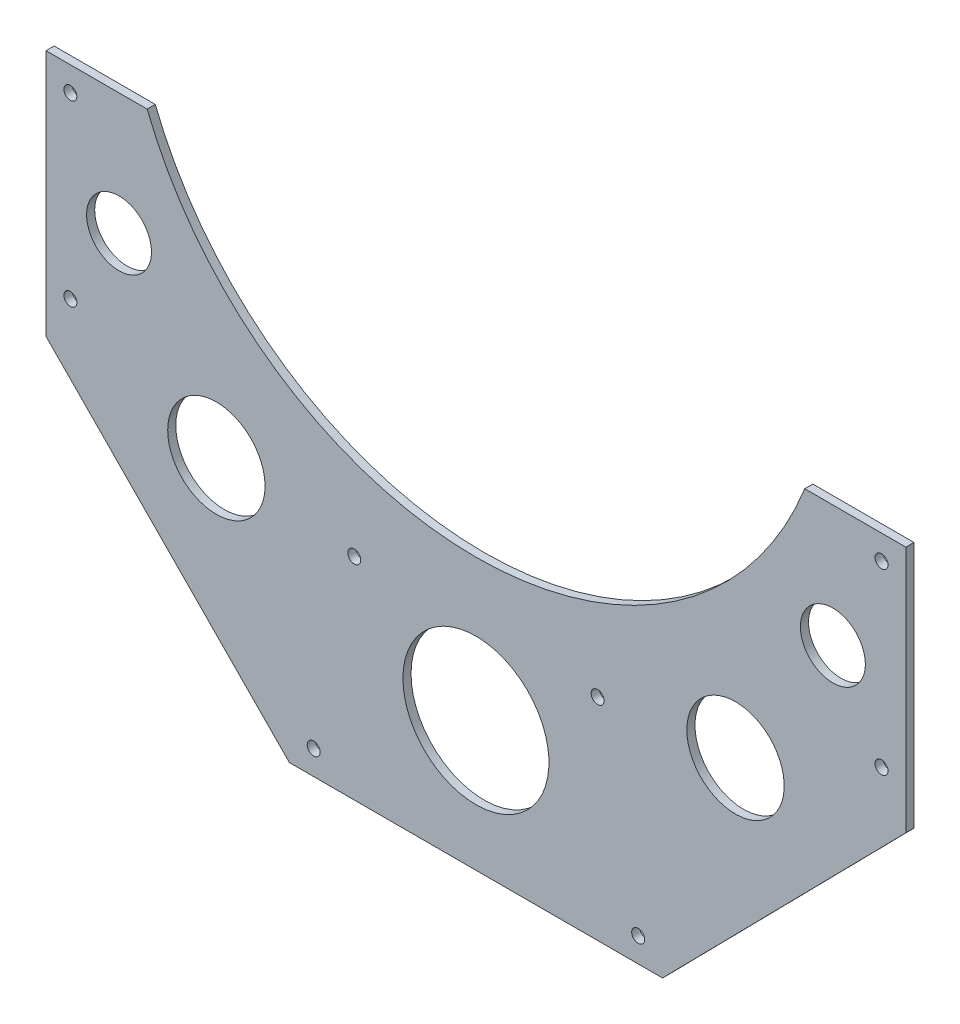
ISO-10303-21;
HEADER;
FILE_DESCRIPTION(('STEP AP214'),'2;1');
FILE_NAME('part.step','',(''),(''),'','','');
FILE_SCHEMA(('AUTOMOTIVE_DESIGN { 1 0 10303 214 1 1 1 1 }'));
ENDSEC;
DATA;
#1=APPLICATION_CONTEXT('core data for automotive mechanical design processes');
#2=APPLICATION_PROTOCOL_DEFINITION('international standard','automotive_design',2000,#1);
#3=PRODUCT_CONTEXT('',#1,'mechanical');
#4=PRODUCT('Part','Part','',(#3));
#5=PRODUCT_RELATED_PRODUCT_CATEGORY('part','',(#4));
#6=PRODUCT_DEFINITION_FORMATION('','',#4);
#7=PRODUCT_DEFINITION_CONTEXT('part definition',#1,'design');
#8=PRODUCT_DEFINITION('design','',#6,#7);
#9=PRODUCT_DEFINITION_SHAPE('','',#8);
#10=(LENGTH_UNIT() NAMED_UNIT(*) SI_UNIT(.MILLI.,.METRE.));
#11=(NAMED_UNIT(*) PLANE_ANGLE_UNIT() SI_UNIT($,.RADIAN.));
#12=(NAMED_UNIT(*) SI_UNIT($,.STERADIAN.) SOLID_ANGLE_UNIT());
#13=UNCERTAINTY_MEASURE_WITH_UNIT(LENGTH_MEASURE(1.E-05),#10,'distance_accuracy_value','');
#14=(GEOMETRIC_REPRESENTATION_CONTEXT(3) GLOBAL_UNCERTAINTY_ASSIGNED_CONTEXT((#13)) GLOBAL_UNIT_ASSIGNED_CONTEXT((#10,
#11,#12)) REPRESENTATION_CONTEXT('',''));
#15=CARTESIAN_POINT('',(0.,0.,0.));
#16=DIRECTION('',(0.,0.,1.));
#17=DIRECTION('',(1.,0.,0.));
#18=AXIS2_PLACEMENT_3D('',#15,#16,#17);
#19=CARTESIAN_POINT('',(0.,610.,10.));
#20=DIRECTION('',(0.,-1.,0.));
#21=DIRECTION('',(0.,0.,-1.));
#22=AXIS2_PLACEMENT_3D('',#19,#20,#21);
#23=PLANE('',#22);
#24=DIRECTION('',(-1.,0.,0.));
#25=VECTOR('',#24,1.);
#26=CARTESIAN_POINT('',(0.,610.,0.));
#27=LINE('',#26,#25);
#28=CARTESIAN_POINT('',(1060.,610.,0.));
#29=VERTEX_POINT('',#28);
#30=CARTESIAN_POINT('',(935.312302428634,610.,0.));
#31=VERTEX_POINT('',#30);
#32=EDGE_CURVE('E119',#29,#31,#27,.T.);
#33=ORIENTED_EDGE('',*,*,#32,.T.);
#34=DIRECTION('',(0.,0.,1.));
#35=VECTOR('',#34,1.);
#36=CARTESIAN_POINT('',(935.312302428634,610.,0.));
#37=LINE('',#36,#35);
#38=CARTESIAN_POINT('',(935.312302428634,610.,10.));
#39=VERTEX_POINT('',#38);
#40=EDGE_CURVE('E59',#31,#39,#37,.T.);
#41=ORIENTED_EDGE('',*,*,#40,.T.);
#42=DIRECTION('',(-1.,0.,0.));
#43=VECTOR('',#42,1.);
#44=CARTESIAN_POINT('',(0.,610.,10.));
#45=LINE('',#44,#43);
#46=CARTESIAN_POINT('',(1060.,610.,10.));
#47=VERTEX_POINT('',#46);
#48=EDGE_CURVE('E130',#47,#39,#45,.T.);
#49=ORIENTED_EDGE('',*,*,#48,.F.);
#50=DIRECTION('',(0.,0.,-1.));
#51=VECTOR('',#50,1.);
#52=CARTESIAN_POINT('',(1060.,610.,10.));
#53=LINE('',#52,#51);
#54=EDGE_CURVE('E11',#47,#29,#53,.T.);
#55=ORIENTED_EDGE('',*,*,#54,.T.);
#56=EDGE_LOOP('',(#33,#41,#49,#55));
#57=FACE_BOUND('',#56,.T.);
#58=ADVANCED_FACE('F35',(#57),#23,.F.);
#59=CARTESIAN_POINT('',(0.,0.,10.));
#60=DIRECTION('',(1.,0.,0.));
#61=DIRECTION('',(0.,0.,-1.));
#62=AXIS2_PLACEMENT_3D('',#59,#60,#61);
#63=PLANE('',#62);
#64=DIRECTION('',(0.,-1.,0.));
#65=VECTOR('',#64,1.);
#66=CARTESIAN_POINT('',(0.,0.,0.));
#67=LINE('',#66,#65);
#68=CARTESIAN_POINT('',(0.,610.,0.));
#69=VERTEX_POINT('',#68);
#70=CARTESIAN_POINT('',(0.,305.,0.));
#71=VERTEX_POINT('',#70);
#72=EDGE_CURVE('E124',#69,#71,#67,.T.);
#73=ORIENTED_EDGE('',*,*,#72,.T.);
#74=DIRECTION('',(0.,0.,1.));
#75=VECTOR('',#74,1.);
#76=CARTESIAN_POINT('',(0.,305.,0.));
#77=LINE('',#76,#75);
#78=CARTESIAN_POINT('',(0.,305.,10.));
#79=VERTEX_POINT('',#78);
#80=EDGE_CURVE('E144',#71,#79,#77,.T.);
#81=ORIENTED_EDGE('',*,*,#80,.T.);
#82=DIRECTION('',(0.,-1.,0.));
#83=VECTOR('',#82,1.);
#84=CARTESIAN_POINT('',(0.,0.,10.));
#85=LINE('',#84,#83);
#86=CARTESIAN_POINT('',(0.,610.,10.));
#87=VERTEX_POINT('',#86);
#88=EDGE_CURVE('E128',#87,#79,#85,.T.);
#89=ORIENTED_EDGE('',*,*,#88,.F.);
#90=DIRECTION('',(0.,0.,-1.));
#91=VECTOR('',#90,1.);
#92=CARTESIAN_POINT('',(0.,610.,10.));
#93=LINE('',#92,#91);
#94=EDGE_CURVE('E44',#87,#69,#93,.T.);
#95=ORIENTED_EDGE('',*,*,#94,.T.);
#96=EDGE_LOOP('',(#73,#81,#89,#95));
#97=FACE_BOUND('',#96,.T.);
#98=ADVANCED_FACE('F37',(#97),#63,.F.);
#99=CARTESIAN_POINT('',(0.,0.,10.));
#100=DIRECTION('',(0.,1.,0.));
#101=DIRECTION('',(0.,0.,1.));
#102=AXIS2_PLACEMENT_3D('',#99,#100,#101);
#103=PLANE('',#102);
#104=DIRECTION('',(1.,0.,0.));
#105=VECTOR('',#104,1.);
#106=CARTESIAN_POINT('',(0.,0.,0.));
#107=LINE('',#106,#105);
#108=CARTESIAN_POINT('',(300.,0.,0.));
#109=VERTEX_POINT('',#108);
#110=CARTESIAN_POINT('',(760.,0.,0.));
#111=VERTEX_POINT('',#110);
#112=EDGE_CURVE('E121',#109,#111,#107,.T.);
#113=ORIENTED_EDGE('',*,*,#112,.T.);
#114=DIRECTION('',(0.,0.,1.));
#115=VECTOR('',#114,1.);
#116=CARTESIAN_POINT('',(760.,0.,0.));
#117=LINE('',#116,#115);
#118=CARTESIAN_POINT('',(760.,0.,10.));
#119=VERTEX_POINT('',#118);
#120=EDGE_CURVE('E51',#111,#119,#117,.T.);
#121=ORIENTED_EDGE('',*,*,#120,.T.);
#122=DIRECTION('',(1.,0.,0.));
#123=VECTOR('',#122,1.);
#124=CARTESIAN_POINT('',(0.,0.,10.));
#125=LINE('',#124,#123);
#126=CARTESIAN_POINT('',(300.,0.,10.));
#127=VERTEX_POINT('',#126);
#128=EDGE_CURVE('E155',#127,#119,#125,.T.);
#129=ORIENTED_EDGE('',*,*,#128,.F.);
#130=DIRECTION('',(0.,0.,1.));
#131=VECTOR('',#130,1.);
#132=CARTESIAN_POINT('',(300.,0.,0.));
#133=LINE('',#132,#131);
#134=EDGE_CURVE('E146',#109,#127,#133,.T.);
#135=ORIENTED_EDGE('',*,*,#134,.F.);
#136=EDGE_LOOP('',(#113,#121,#129,#135));
#137=FACE_BOUND('',#136,.T.);
#138=ADVANCED_FACE('F309',(#137),#103,.F.);
#139=CARTESIAN_POINT('',(1060.,0.,10.));
#140=DIRECTION('',(-1.,0.,0.));
#141=DIRECTION('',(0.,0.,1.));
#142=AXIS2_PLACEMENT_3D('',#139,#140,#141);
#143=PLANE('',#142);
#144=DIRECTION('',(0.,1.,0.));
#145=VECTOR('',#144,1.);
#146=CARTESIAN_POINT('',(1060.,0.,10.));
#147=LINE('',#146,#145);
#148=CARTESIAN_POINT('',(1060.,305.,10.));
#149=VERTEX_POINT('',#148);
#150=EDGE_CURVE('E114',#149,#47,#147,.T.);
#151=ORIENTED_EDGE('',*,*,#150,.F.);
#152=DIRECTION('',(0.,0.,1.));
#153=VECTOR('',#152,1.);
#154=CARTESIAN_POINT('',(1060.,305.,0.));
#155=LINE('',#154,#153);
#156=CARTESIAN_POINT('',(1060.,305.,0.));
#157=VERTEX_POINT('',#156);
#158=EDGE_CURVE('E101',#157,#149,#155,.T.);
#159=ORIENTED_EDGE('',*,*,#158,.F.);
#160=DIRECTION('',(0.,1.,0.));
#161=VECTOR('',#160,1.);
#162=CARTESIAN_POINT('',(1060.,0.,0.));
#163=LINE('',#162,#161);
#164=EDGE_CURVE('E113',#157,#29,#163,.T.);
#165=ORIENTED_EDGE('',*,*,#164,.T.);
#166=ORIENTED_EDGE('',*,*,#54,.F.);
#167=EDGE_LOOP('',(#151,#159,#165,#166));
#168=FACE_BOUND('',#167,.T.);
#169=ADVANCED_FACE('F111',(#168),#143,.F.);
#170=CARTESIAN_POINT('',(124.687697571367,610.,10.));
#171=VERTEX_POINT('',#170);
#172=EDGE_CURVE('E137',#171,#87,#45,.T.);
#173=ORIENTED_EDGE('',*,*,#172,.F.);
#174=DIRECTION('',(0.,0.,1.));
#175=VECTOR('',#174,1.);
#176=CARTESIAN_POINT('',(124.687697571367,610.,0.));
#177=LINE('',#176,#175);
#178=CARTESIAN_POINT('',(124.687697571367,610.,0.));
#179=VERTEX_POINT('',#178);
#180=EDGE_CURVE('E161',#179,#171,#177,.T.);
#181=ORIENTED_EDGE('',*,*,#180,.F.);
#182=EDGE_CURVE('E120',#179,#69,#27,.T.);
#183=ORIENTED_EDGE('',*,*,#182,.T.);
#184=ORIENTED_EDGE('',*,*,#94,.F.);
#185=EDGE_LOOP('',(#173,#181,#183,#184));
#186=FACE_BOUND('',#185,.T.);
#187=ADVANCED_FACE('F305',(#186),#23,.F.);
#188=CARTESIAN_POINT('',(0.,0.,10.));
#189=DIRECTION('',(0.,0.,-1.));
#190=DIRECTION('',(-1.,0.,0.));
#191=AXIS2_PLACEMENT_3D('',#188,#189,#190);
#192=PLANE('',#191);
#193=CARTESIAN_POINT('',(850.,280.,10.));
#194=DIRECTION('',(0.,0.,-1.));
#195=DIRECTION('',(-1.,0.,0.));
#196=AXIS2_PLACEMENT_3D('',#193,#194,#195);
#197=CIRCLE('',#196,60.);
#198=CARTESIAN_POINT('',(790.,280.,10.));
#199=VERTEX_POINT('',#198);
#200=EDGE_CURVE('E225',#199,#199,#197,.T.);
#201=ORIENTED_EDGE('',*,*,#200,.T.);
#202=EDGE_LOOP('',(#201));
#203=FACE_BOUND('',#202,.T.);
#204=CARTESIAN_POINT('',(530.,160.,10.));
#205=DIRECTION('',(0.,0.,-1.));
#206=DIRECTION('',(-1.,0.,0.));
#207=AXIS2_PLACEMENT_3D('',#204,#205,#206);
#208=CIRCLE('',#207,90.);
#209=CARTESIAN_POINT('',(440.,160.,10.));
#210=VERTEX_POINT('',#209);
#211=EDGE_CURVE('E243',#210,#210,#208,.T.);
#212=ORIENTED_EDGE('',*,*,#211,.T.);
#213=EDGE_LOOP('',(#212));
#214=FACE_BOUND('',#213,.T.);
#215=CARTESIAN_POINT('',(210.,280.,10.));
#216=DIRECTION('',(0.,0.,-1.));
#217=DIRECTION('',(-1.,0.,0.));
#218=AXIS2_PLACEMENT_3D('',#215,#216,#217);
#219=CIRCLE('',#218,60.);
#220=CARTESIAN_POINT('',(150.,280.,10.));
#221=VERTEX_POINT('',#220);
#222=EDGE_CURVE('E237',#221,#221,#219,.T.);
#223=ORIENTED_EDGE('',*,*,#222,.T.);
#224=EDGE_LOOP('',(#223));
#225=FACE_BOUND('',#224,.T.);
#226=CARTESIAN_POINT('',(90.,460.,10.));
#227=DIRECTION('',(0.,0.,-1.));
#228=DIRECTION('',(-1.,0.,0.));
#229=AXIS2_PLACEMENT_3D('',#226,#227,#228);
#230=CIRCLE('',#229,40.);
#231=CARTESIAN_POINT('',(50.,460.,10.));
#232=VERTEX_POINT('',#231);
#233=EDGE_CURVE('E231',#232,#232,#230,.T.);
#234=ORIENTED_EDGE('',*,*,#233,.T.);
#235=EDGE_LOOP('',(#234));
#236=FACE_BOUND('',#235,.T.);
#237=CARTESIAN_POINT('',(970.,460.,10.));
#238=DIRECTION('',(0.,0.,-1.));
#239=DIRECTION('',(-1.,0.,0.));
#240=AXIS2_PLACEMENT_3D('',#237,#238,#239);
#241=CIRCLE('',#240,40.);
#242=CARTESIAN_POINT('',(930.,460.,10.));
#243=VERTEX_POINT('',#242);
#244=EDGE_CURVE('E221',#243,#243,#241,.T.);
#245=ORIENTED_EDGE('',*,*,#244,.T.);
#246=EDGE_LOOP('',(#245));
#247=FACE_BOUND('',#246,.T.);
#248=CARTESIAN_POINT('',(1030.,580.,10.));
#249=DIRECTION('',(0.,0.,-1.));
#250=DIRECTION('',(-1.,0.,0.));
#251=AXIS2_PLACEMENT_3D('',#248,#249,#250);
#252=CIRCLE('',#251,8.00000000000001);
#253=CARTESIAN_POINT('',(1022.,580.,10.));
#254=VERTEX_POINT('',#253);
#255=EDGE_CURVE('E215',#254,#254,#252,.T.);
#256=ORIENTED_EDGE('',*,*,#255,.T.);
#257=EDGE_LOOP('',(#256));
#258=FACE_BOUND('',#257,.T.);
#259=CARTESIAN_POINT('',(1030.,360.,10.));
#260=DIRECTION('',(0.,0.,-1.));
#261=DIRECTION('',(-1.,0.,0.));
#262=AXIS2_PLACEMENT_3D('',#259,#260,#261);
#263=CIRCLE('',#262,8.00000000000001);
#264=CARTESIAN_POINT('',(1022.,360.,10.));
#265=VERTEX_POINT('',#264);
#266=EDGE_CURVE('E209',#265,#265,#263,.T.);
#267=ORIENTED_EDGE('',*,*,#266,.T.);
#268=EDGE_LOOP('',(#267));
#269=FACE_BOUND('',#268,.T.);
#270=CARTESIAN_POINT('',(730.,30.,10.));
#271=DIRECTION('',(0.,0.,-1.));
#272=DIRECTION('',(-1.,0.,0.));
#273=AXIS2_PLACEMENT_3D('',#270,#271,#272);
#274=CIRCLE('',#273,8.00000000000001);
#275=CARTESIAN_POINT('',(722.,30.,10.));
#276=VERTEX_POINT('',#275);
#277=EDGE_CURVE('E203',#276,#276,#274,.T.);
#278=ORIENTED_EDGE('',*,*,#277,.T.);
#279=EDGE_LOOP('',(#278));
#280=FACE_BOUND('',#279,.T.);
#281=CARTESIAN_POINT('',(330.,30.,10.));
#282=DIRECTION('',(0.,0.,-1.));
#283=DIRECTION('',(-1.,0.,0.));
#284=AXIS2_PLACEMENT_3D('',#281,#282,#283);
#285=CIRCLE('',#284,8.00000000000001);
#286=CARTESIAN_POINT('',(322.,30.,10.));
#287=VERTEX_POINT('',#286);
#288=EDGE_CURVE('E197',#287,#287,#285,.T.);
#289=ORIENTED_EDGE('',*,*,#288,.T.);
#290=EDGE_LOOP('',(#289));
#291=FACE_BOUND('',#290,.T.);
#292=CARTESIAN_POINT('',(30.,360.,10.));
#293=DIRECTION('',(0.,0.,-1.));
#294=DIRECTION('',(-1.,0.,0.));
#295=AXIS2_PLACEMENT_3D('',#292,#293,#294);
#296=CIRCLE('',#295,7.99999999999998);
#297=CARTESIAN_POINT('',(22.,360.,10.));
#298=VERTEX_POINT('',#297);
#299=EDGE_CURVE('E191',#298,#298,#296,.T.);
#300=ORIENTED_EDGE('',*,*,#299,.T.);
#301=EDGE_LOOP('',(#300));
#302=FACE_BOUND('',#301,.T.);
#303=CARTESIAN_POINT('',(30.,580.,10.));
#304=DIRECTION('',(0.,0.,-1.));
#305=DIRECTION('',(-1.,0.,0.));
#306=AXIS2_PLACEMENT_3D('',#303,#304,#305);
#307=CIRCLE('',#306,7.99999999999998);
#308=CARTESIAN_POINT('',(22.,580.,10.));
#309=VERTEX_POINT('',#308);
#310=EDGE_CURVE('E185',#309,#309,#307,.T.);
#311=ORIENTED_EDGE('',*,*,#310,.T.);
#312=EDGE_LOOP('',(#311));
#313=FACE_BOUND('',#312,.T.);
#314=CARTESIAN_POINT('',(680.,260.,10.));
#315=DIRECTION('',(0.,0.,-1.));
#316=DIRECTION('',(-1.,0.,0.));
#317=AXIS2_PLACEMENT_3D('',#314,#315,#316);
#318=CIRCLE('',#317,8.00000000000001);
#319=CARTESIAN_POINT('',(672.,260.,10.));
#320=VERTEX_POINT('',#319);
#321=EDGE_CURVE('E39',#320,#320,#318,.T.);
#322=ORIENTED_EDGE('',*,*,#321,.T.);
#323=EDGE_LOOP('',(#322));
#324=FACE_BOUND('',#323,.T.);
#325=CARTESIAN_POINT('',(380.,260.,10.));
#326=DIRECTION('',(0.,0.,-1.));
#327=DIRECTION('',(-1.,0.,0.));
#328=AXIS2_PLACEMENT_3D('',#325,#326,#327);
#329=CIRCLE('',#328,8.00000000000001);
#330=CARTESIAN_POINT('',(372.,260.,10.));
#331=VERTEX_POINT('',#330);
#332=EDGE_CURVE('E173',#331,#331,#329,.T.);
#333=ORIENTED_EDGE('',*,*,#332,.T.);
#334=EDGE_LOOP('',(#333));
#335=FACE_BOUND('',#334,.T.);
#336=ORIENTED_EDGE('',*,*,#128,.T.);
#337=DIRECTION('',(-0.701238976116888,-0.712926292385502,0.));
#338=VECTOR('',#337,1.);
#339=CARTESIAN_POINT('',(1060.,305.,10.));
#340=LINE('',#339,#338);
#341=EDGE_CURVE('E107',#149,#119,#340,.T.);
#342=ORIENTED_EDGE('',*,*,#341,.F.);
#343=ORIENTED_EDGE('',*,*,#150,.T.);
#344=ORIENTED_EDGE('',*,*,#48,.T.);
#345=CARTESIAN_POINT('',(530.,770.,10.));
#346=DIRECTION('',(0.,0.,1.));
#347=DIRECTION('',(1.,0.,0.));
#348=AXIS2_PLACEMENT_3D('',#345,#346,#347);
#349=CIRCLE('',#348,435.75);
#350=EDGE_CURVE('E165',#171,#39,#349,.T.);
#351=ORIENTED_EDGE('',*,*,#350,.F.);
#352=ORIENTED_EDGE('',*,*,#172,.T.);
#353=ORIENTED_EDGE('',*,*,#88,.T.);
#354=DIRECTION('',(-0.701238976116888,0.712926292385503,0.));
#355=VECTOR('',#354,1.);
#356=CARTESIAN_POINT('',(0.,305.,10.));
#357=LINE('',#356,#355);
#358=EDGE_CURVE('E152',#127,#79,#357,.T.);
#359=ORIENTED_EDGE('',*,*,#358,.F.);
#360=EDGE_LOOP('',(#336,#342,#343,#344,#351,#352,#353,#359));
#361=FACE_BOUND('',#360,.T.);
#362=ADVANCED_FACE('F159',(#203,#214,#225,#236,#247,#258,#269,#280,#291,#302,#313,#324,#335,
#361),#192,.F.);
#363=CARTESIAN_POINT('',(0.,0.,0.));
#364=DIRECTION('',(0.,0.,-1.));
#365=DIRECTION('',(-1.,0.,0.));
#366=AXIS2_PLACEMENT_3D('',#363,#364,#365);
#367=PLANE('',#366);
#368=CARTESIAN_POINT('',(850.,280.,0.));
#369=DIRECTION('',(0.,0.,-1.));
#370=DIRECTION('',(-1.,0.,0.));
#371=AXIS2_PLACEMENT_3D('',#368,#369,#370);
#372=CIRCLE('',#371,60.);
#373=CARTESIAN_POINT('',(790.,280.,0.));
#374=VERTEX_POINT('',#373);
#375=EDGE_CURVE('E246',#374,#374,#372,.T.);
#376=ORIENTED_EDGE('',*,*,#375,.F.);
#377=EDGE_LOOP('',(#376));
#378=FACE_BOUND('',#377,.T.);
#379=CARTESIAN_POINT('',(530.,160.,0.));
#380=DIRECTION('',(0.,0.,-1.));
#381=DIRECTION('',(-1.,0.,0.));
#382=AXIS2_PLACEMENT_3D('',#379,#380,#381);
#383=CIRCLE('',#382,90.);
#384=CARTESIAN_POINT('',(440.,160.,0.));
#385=VERTEX_POINT('',#384);
#386=EDGE_CURVE('E240',#385,#385,#383,.T.);
#387=ORIENTED_EDGE('',*,*,#386,.F.);
#388=EDGE_LOOP('',(#387));
#389=FACE_BOUND('',#388,.T.);
#390=CARTESIAN_POINT('',(210.,280.,0.));
#391=DIRECTION('',(0.,0.,-1.));
#392=DIRECTION('',(-1.,0.,0.));
#393=AXIS2_PLACEMENT_3D('',#390,#391,#392);
#394=CIRCLE('',#393,60.);
#395=CARTESIAN_POINT('',(150.,280.,0.));
#396=VERTEX_POINT('',#395);
#397=EDGE_CURVE('E234',#396,#396,#394,.T.);
#398=ORIENTED_EDGE('',*,*,#397,.F.);
#399=EDGE_LOOP('',(#398));
#400=FACE_BOUND('',#399,.T.);
#401=CARTESIAN_POINT('',(90.,460.,0.));
#402=DIRECTION('',(0.,0.,-1.));
#403=DIRECTION('',(-1.,0.,0.));
#404=AXIS2_PLACEMENT_3D('',#401,#402,#403);
#405=CIRCLE('',#404,40.);
#406=CARTESIAN_POINT('',(50.,460.,0.));
#407=VERTEX_POINT('',#406);
#408=EDGE_CURVE('E228',#407,#407,#405,.T.);
#409=ORIENTED_EDGE('',*,*,#408,.F.);
#410=EDGE_LOOP('',(#409));
#411=FACE_BOUND('',#410,.T.);
#412=CARTESIAN_POINT('',(970.,460.,0.));
#413=DIRECTION('',(0.,0.,-1.));
#414=DIRECTION('',(-1.,0.,0.));
#415=AXIS2_PLACEMENT_3D('',#412,#413,#414);
#416=CIRCLE('',#415,40.);
#417=CARTESIAN_POINT('',(930.,460.,0.));
#418=VERTEX_POINT('',#417);
#419=EDGE_CURVE('E222',#418,#418,#416,.T.);
#420=ORIENTED_EDGE('',*,*,#419,.F.);
#421=EDGE_LOOP('',(#420));
#422=FACE_BOUND('',#421,.T.);
#423=CARTESIAN_POINT('',(1030.,580.,0.));
#424=DIRECTION('',(0.,0.,-1.));
#425=DIRECTION('',(-1.,0.,0.));
#426=AXIS2_PLACEMENT_3D('',#423,#424,#425);
#427=CIRCLE('',#426,8.00000000000001);
#428=CARTESIAN_POINT('',(1022.,580.,0.));
#429=VERTEX_POINT('',#428);
#430=EDGE_CURVE('E218',#429,#429,#427,.T.);
#431=ORIENTED_EDGE('',*,*,#430,.F.);
#432=EDGE_LOOP('',(#431));
#433=FACE_BOUND('',#432,.T.);
#434=CARTESIAN_POINT('',(1030.,360.,0.));
#435=DIRECTION('',(0.,0.,-1.));
#436=DIRECTION('',(-1.,0.,0.));
#437=AXIS2_PLACEMENT_3D('',#434,#435,#436);
#438=CIRCLE('',#437,8.00000000000001);
#439=CARTESIAN_POINT('',(1022.,360.,0.));
#440=VERTEX_POINT('',#439);
#441=EDGE_CURVE('E212',#440,#440,#438,.T.);
#442=ORIENTED_EDGE('',*,*,#441,.F.);
#443=EDGE_LOOP('',(#442));
#444=FACE_BOUND('',#443,.T.);
#445=CARTESIAN_POINT('',(730.,30.,0.));
#446=DIRECTION('',(0.,0.,-1.));
#447=DIRECTION('',(-1.,0.,0.));
#448=AXIS2_PLACEMENT_3D('',#445,#446,#447);
#449=CIRCLE('',#448,8.00000000000001);
#450=CARTESIAN_POINT('',(722.,30.,0.));
#451=VERTEX_POINT('',#450);
#452=EDGE_CURVE('E206',#451,#451,#449,.T.);
#453=ORIENTED_EDGE('',*,*,#452,.F.);
#454=EDGE_LOOP('',(#453));
#455=FACE_BOUND('',#454,.T.);
#456=CARTESIAN_POINT('',(330.,30.,0.));
#457=DIRECTION('',(0.,0.,-1.));
#458=DIRECTION('',(-1.,0.,0.));
#459=AXIS2_PLACEMENT_3D('',#456,#457,#458);
#460=CIRCLE('',#459,8.00000000000001);
#461=CARTESIAN_POINT('',(322.,30.,0.));
#462=VERTEX_POINT('',#461);
#463=EDGE_CURVE('E200',#462,#462,#460,.T.);
#464=ORIENTED_EDGE('',*,*,#463,.F.);
#465=EDGE_LOOP('',(#464));
#466=FACE_BOUND('',#465,.T.);
#467=CARTESIAN_POINT('',(30.,360.,0.));
#468=DIRECTION('',(0.,0.,-1.));
#469=DIRECTION('',(-1.,0.,0.));
#470=AXIS2_PLACEMENT_3D('',#467,#468,#469);
#471=CIRCLE('',#470,7.99999999999999);
#472=CARTESIAN_POINT('',(22.,360.,0.));
#473=VERTEX_POINT('',#472);
#474=EDGE_CURVE('E194',#473,#473,#471,.T.);
#475=ORIENTED_EDGE('',*,*,#474,.F.);
#476=EDGE_LOOP('',(#475));
#477=FACE_BOUND('',#476,.T.);
#478=CARTESIAN_POINT('',(30.,580.,0.));
#479=DIRECTION('',(0.,0.,-1.));
#480=DIRECTION('',(-1.,0.,0.));
#481=AXIS2_PLACEMENT_3D('',#478,#479,#480);
#482=CIRCLE('',#481,7.99999999999999);
#483=CARTESIAN_POINT('',(22.,580.,0.));
#484=VERTEX_POINT('',#483);
#485=EDGE_CURVE('E188',#484,#484,#482,.T.);
#486=ORIENTED_EDGE('',*,*,#485,.F.);
#487=EDGE_LOOP('',(#486));
#488=FACE_BOUND('',#487,.T.);
#489=CARTESIAN_POINT('',(680.,260.,0.));
#490=DIRECTION('',(0.,0.,-1.));
#491=DIRECTION('',(-1.,0.,0.));
#492=AXIS2_PLACEMENT_3D('',#489,#490,#491);
#493=CIRCLE('',#492,8.00000000000001);
#494=CARTESIAN_POINT('',(672.,260.,0.));
#495=VERTEX_POINT('',#494);
#496=EDGE_CURVE('E182',#495,#495,#493,.T.);
#497=ORIENTED_EDGE('',*,*,#496,.F.);
#498=EDGE_LOOP('',(#497));
#499=FACE_BOUND('',#498,.T.);
#500=CARTESIAN_POINT('',(380.,260.,0.));
#501=DIRECTION('',(0.,0.,-1.));
#502=DIRECTION('',(-1.,0.,0.));
#503=AXIS2_PLACEMENT_3D('',#500,#501,#502);
#504=CIRCLE('',#503,8.00000000000001);
#505=CARTESIAN_POINT('',(372.,260.,0.));
#506=VERTEX_POINT('',#505);
#507=EDGE_CURVE('E175',#506,#506,#504,.T.);
#508=ORIENTED_EDGE('',*,*,#507,.F.);
#509=EDGE_LOOP('',(#508));
#510=FACE_BOUND('',#509,.T.);
#511=DIRECTION('',(-0.701238976116888,-0.712926292385502,0.));
#512=VECTOR('',#511,1.);
#513=CARTESIAN_POINT('',(1060.,305.,0.));
#514=LINE('',#513,#512);
#515=EDGE_CURVE('E98',#157,#111,#514,.T.);
#516=ORIENTED_EDGE('',*,*,#515,.T.);
#517=ORIENTED_EDGE('',*,*,#112,.F.);
#518=DIRECTION('',(-0.701238976116888,0.712926292385503,0.));
#519=VECTOR('',#518,1.);
#520=CARTESIAN_POINT('',(0.,305.,0.));
#521=LINE('',#520,#519);
#522=EDGE_CURVE('E149',#109,#71,#521,.T.);
#523=ORIENTED_EDGE('',*,*,#522,.T.);
#524=ORIENTED_EDGE('',*,*,#72,.F.);
#525=ORIENTED_EDGE('',*,*,#182,.F.);
#526=CARTESIAN_POINT('',(530.,770.,0.));
#527=DIRECTION('',(0.,0.,1.));
#528=DIRECTION('',(1.,0.,0.));
#529=AXIS2_PLACEMENT_3D('',#526,#527,#528);
#530=CIRCLE('',#529,435.75);
#531=EDGE_CURVE('E162',#179,#31,#530,.T.);
#532=ORIENTED_EDGE('',*,*,#531,.T.);
#533=ORIENTED_EDGE('',*,*,#32,.F.);
#534=ORIENTED_EDGE('',*,*,#164,.F.);
#535=EDGE_LOOP('',(#516,#517,#523,#524,#525,#532,#533,#534));
#536=FACE_BOUND('',#535,.T.);
#537=ADVANCED_FACE('F117',(#378,#389,#400,#411,#422,#433,#444,#455,#466,#477,#488,#499,#510,
#536),#367,.T.);
#538=CARTESIAN_POINT('',(0.,305.,0.));
#539=DIRECTION('',(0.712926292385503,0.701238976116888,0.));
#540=DIRECTION('',(-0.701238976116888,0.712926292385503,0.));
#541=AXIS2_PLACEMENT_3D('',#538,#539,#540);
#542=PLANE('',#541);
#543=ORIENTED_EDGE('',*,*,#358,.T.);
#544=ORIENTED_EDGE('',*,*,#80,.F.);
#545=ORIENTED_EDGE('',*,*,#522,.F.);
#546=ORIENTED_EDGE('',*,*,#134,.T.);
#547=EDGE_LOOP('',(#543,#544,#545,#546));
#548=FACE_BOUND('',#547,.T.);
#549=ADVANCED_FACE('F263',(#548),#542,.F.);
#550=CARTESIAN_POINT('',(530.,770.,0.));
#551=DIRECTION('',(0.,0.,1.));
#552=DIRECTION('',(1.,0.,0.));
#553=AXIS2_PLACEMENT_3D('',#550,#551,#552);
#554=CYLINDRICAL_SURFACE('',#553,435.75);
#555=ORIENTED_EDGE('',*,*,#350,.T.);
#556=ORIENTED_EDGE('',*,*,#40,.F.);
#557=ORIENTED_EDGE('',*,*,#531,.F.);
#558=ORIENTED_EDGE('',*,*,#180,.T.);
#559=EDGE_LOOP('',(#555,#556,#557,#558));
#560=FACE_BOUND('',#559,.T.);
#561=ADVANCED_FACE('F301',(#560),#554,.F.);
#562=CARTESIAN_POINT('',(1060.,305.,0.));
#563=DIRECTION('',(-0.712926292385502,0.701238976116888,0.));
#564=DIRECTION('',(-0.701238976116888,-0.712926292385502,0.));
#565=AXIS2_PLACEMENT_3D('',#562,#563,#564);
#566=PLANE('',#565);
#567=ORIENTED_EDGE('',*,*,#341,.T.);
#568=ORIENTED_EDGE('',*,*,#120,.F.);
#569=ORIENTED_EDGE('',*,*,#515,.F.);
#570=ORIENTED_EDGE('',*,*,#158,.T.);
#571=EDGE_LOOP('',(#567,#568,#569,#570));
#572=FACE_BOUND('',#571,.T.);
#573=ADVANCED_FACE('F100',(#572),#566,.F.);
#574=CARTESIAN_POINT('',(380.,260.,0.));
#575=DIRECTION('',(0.,0.,-1.));
#576=DIRECTION('',(-1.,0.,0.));
#577=AXIS2_PLACEMENT_3D('',#574,#575,#576);
#578=CYLINDRICAL_SURFACE('',#577,8.00000000000001);
#579=ORIENTED_EDGE('',*,*,#507,.T.);
#580=EDGE_LOOP('',(#579));
#581=FACE_BOUND('',#580,.T.);
#582=ORIENTED_EDGE('',*,*,#332,.F.);
#583=EDGE_LOOP('',(#582));
#584=FACE_BOUND('',#583,.T.);
#585=ADVANCED_FACE('F289',(#581,#584),#578,.F.);
#586=CARTESIAN_POINT('',(680.,260.,0.));
#587=DIRECTION('',(0.,0.,-1.));
#588=DIRECTION('',(-1.,0.,0.));
#589=AXIS2_PLACEMENT_3D('',#586,#587,#588);
#590=CYLINDRICAL_SURFACE('',#589,8.00000000000001);
#591=ORIENTED_EDGE('',*,*,#496,.T.);
#592=EDGE_LOOP('',(#591));
#593=FACE_BOUND('',#592,.T.);
#594=ORIENTED_EDGE('',*,*,#321,.F.);
#595=EDGE_LOOP('',(#594));
#596=FACE_BOUND('',#595,.T.);
#597=ADVANCED_FACE('F292',(#593,#596),#590,.F.);
#598=CARTESIAN_POINT('',(30.,580.,0.));
#599=DIRECTION('',(0.,0.,-1.));
#600=DIRECTION('',(-1.,0.,0.));
#601=AXIS2_PLACEMENT_3D('',#598,#599,#600);
#602=CYLINDRICAL_SURFACE('',#601,7.99999999999998);
#603=ORIENTED_EDGE('',*,*,#485,.T.);
#604=EDGE_LOOP('',(#603));
#605=FACE_BOUND('',#604,.T.);
#606=ORIENTED_EDGE('',*,*,#310,.F.);
#607=EDGE_LOOP('',(#606));
#608=FACE_BOUND('',#607,.T.);
#609=ADVANCED_FACE('F298',(#605,#608),#602,.F.);
#610=CARTESIAN_POINT('',(30.,360.,0.));
#611=DIRECTION('',(0.,0.,-1.));
#612=DIRECTION('',(-1.,0.,0.));
#613=AXIS2_PLACEMENT_3D('',#610,#611,#612);
#614=CYLINDRICAL_SURFACE('',#613,7.99999999999998);
#615=ORIENTED_EDGE('',*,*,#474,.T.);
#616=EDGE_LOOP('',(#615));
#617=FACE_BOUND('',#616,.T.);
#618=ORIENTED_EDGE('',*,*,#299,.F.);
#619=EDGE_LOOP('',(#618));
#620=FACE_BOUND('',#619,.T.);
#621=ADVANCED_FACE('F353',(#617,#620),#614,.F.);
#622=CARTESIAN_POINT('',(330.,30.,0.));
#623=DIRECTION('',(0.,0.,-1.));
#624=DIRECTION('',(-1.,0.,0.));
#625=AXIS2_PLACEMENT_3D('',#622,#623,#624);
#626=CYLINDRICAL_SURFACE('',#625,8.00000000000001);
#627=ORIENTED_EDGE('',*,*,#463,.T.);
#628=EDGE_LOOP('',(#627));
#629=FACE_BOUND('',#628,.T.);
#630=ORIENTED_EDGE('',*,*,#288,.F.);
#631=EDGE_LOOP('',(#630));
#632=FACE_BOUND('',#631,.T.);
#633=ADVANCED_FACE('F363',(#629,#632),#626,.F.);
#634=CARTESIAN_POINT('',(730.,30.,0.));
#635=DIRECTION('',(0.,0.,-1.));
#636=DIRECTION('',(-1.,0.,0.));
#637=AXIS2_PLACEMENT_3D('',#634,#635,#636);
#638=CYLINDRICAL_SURFACE('',#637,8.00000000000001);
#639=ORIENTED_EDGE('',*,*,#452,.T.);
#640=EDGE_LOOP('',(#639));
#641=FACE_BOUND('',#640,.T.);
#642=ORIENTED_EDGE('',*,*,#277,.F.);
#643=EDGE_LOOP('',(#642));
#644=FACE_BOUND('',#643,.T.);
#645=ADVANCED_FACE('F373',(#641,#644),#638,.F.);
#646=CARTESIAN_POINT('',(1030.,360.,0.));
#647=DIRECTION('',(0.,0.,-1.));
#648=DIRECTION('',(-1.,0.,0.));
#649=AXIS2_PLACEMENT_3D('',#646,#647,#648);
#650=CYLINDRICAL_SURFACE('',#649,8.00000000000001);
#651=ORIENTED_EDGE('',*,*,#441,.T.);
#652=EDGE_LOOP('',(#651));
#653=FACE_BOUND('',#652,.T.);
#654=ORIENTED_EDGE('',*,*,#266,.F.);
#655=EDGE_LOOP('',(#654));
#656=FACE_BOUND('',#655,.T.);
#657=ADVANCED_FACE('F383',(#653,#656),#650,.F.);
#658=CARTESIAN_POINT('',(1030.,580.,0.));
#659=DIRECTION('',(0.,0.,-1.));
#660=DIRECTION('',(-1.,0.,0.));
#661=AXIS2_PLACEMENT_3D('',#658,#659,#660);
#662=CYLINDRICAL_SURFACE('',#661,8.00000000000001);
#663=ORIENTED_EDGE('',*,*,#430,.T.);
#664=EDGE_LOOP('',(#663));
#665=FACE_BOUND('',#664,.T.);
#666=ORIENTED_EDGE('',*,*,#255,.F.);
#667=EDGE_LOOP('',(#666));
#668=FACE_BOUND('',#667,.T.);
#669=ADVANCED_FACE('F393',(#665,#668),#662,.F.);
#670=CARTESIAN_POINT('',(970.,460.,10.));
#671=DIRECTION('',(0.,0.,-1.));
#672=DIRECTION('',(-1.,0.,0.));
#673=AXIS2_PLACEMENT_3D('',#670,#671,#672);
#674=CYLINDRICAL_SURFACE('',#673,40.);
#675=ORIENTED_EDGE('',*,*,#244,.F.);
#676=EDGE_LOOP('',(#675));
#677=FACE_BOUND('',#676,.T.);
#678=ORIENTED_EDGE('',*,*,#419,.T.);
#679=EDGE_LOOP('',(#678));
#680=FACE_BOUND('',#679,.T.);
#681=ADVANCED_FACE('F403',(#677,#680),#674,.F.);
#682=CARTESIAN_POINT('',(90.,460.,10.));
#683=DIRECTION('',(0.,0.,-1.));
#684=DIRECTION('',(-1.,0.,0.));
#685=AXIS2_PLACEMENT_3D('',#682,#683,#684);
#686=CYLINDRICAL_SURFACE('',#685,40.);
#687=ORIENTED_EDGE('',*,*,#233,.F.);
#688=EDGE_LOOP('',(#687));
#689=FACE_BOUND('',#688,.T.);
#690=ORIENTED_EDGE('',*,*,#408,.T.);
#691=EDGE_LOOP('',(#690));
#692=FACE_BOUND('',#691,.T.);
#693=ADVANCED_FACE('F427',(#689,#692),#686,.F.);
#694=CARTESIAN_POINT('',(210.,280.,10.));
#695=DIRECTION('',(0.,0.,-1.));
#696=DIRECTION('',(-1.,0.,0.));
#697=AXIS2_PLACEMENT_3D('',#694,#695,#696);
#698=CYLINDRICAL_SURFACE('',#697,60.);
#699=ORIENTED_EDGE('',*,*,#222,.F.);
#700=EDGE_LOOP('',(#699));
#701=FACE_BOUND('',#700,.T.);
#702=ORIENTED_EDGE('',*,*,#397,.T.);
#703=EDGE_LOOP('',(#702));
#704=FACE_BOUND('',#703,.T.);
#705=ADVANCED_FACE('F437',(#701,#704),#698,.F.);
#706=CARTESIAN_POINT('',(530.,160.,10.));
#707=DIRECTION('',(0.,0.,-1.));
#708=DIRECTION('',(-1.,0.,0.));
#709=AXIS2_PLACEMENT_3D('',#706,#707,#708);
#710=CYLINDRICAL_SURFACE('',#709,90.);
#711=ORIENTED_EDGE('',*,*,#211,.F.);
#712=EDGE_LOOP('',(#711));
#713=FACE_BOUND('',#712,.T.);
#714=ORIENTED_EDGE('',*,*,#386,.T.);
#715=EDGE_LOOP('',(#714));
#716=FACE_BOUND('',#715,.T.);
#717=ADVANCED_FACE('F257',(#713,#716),#710,.F.);
#718=CARTESIAN_POINT('',(850.,280.,10.));
#719=DIRECTION('',(0.,0.,-1.));
#720=DIRECTION('',(-1.,0.,0.));
#721=AXIS2_PLACEMENT_3D('',#718,#719,#720);
#722=CYLINDRICAL_SURFACE('',#721,60.);
#723=ORIENTED_EDGE('',*,*,#200,.F.);
#724=EDGE_LOOP('',(#723));
#725=FACE_BOUND('',#724,.T.);
#726=ORIENTED_EDGE('',*,*,#375,.T.);
#727=EDGE_LOOP('',(#726));
#728=FACE_BOUND('',#727,.T.);
#729=ADVANCED_FACE('F254',(#725,#728),#722,.F.);
#730=CLOSED_SHELL('',(#58,#98,#138,#169,#187,#362,#537,#549,#561,#573,#585,#597,#609,#621,#633,
#645,#657,#669,#681,#693,#705,#717,#729));
#731=MANIFOLD_SOLID_BREP('B2',#730);
#732=ADVANCED_BREP_SHAPE_REPRESENTATION('',(#18,#731),#14);
#733=SHAPE_DEFINITION_REPRESENTATION(#9,#732);
ENDSEC;
END-ISO-10303-21;
